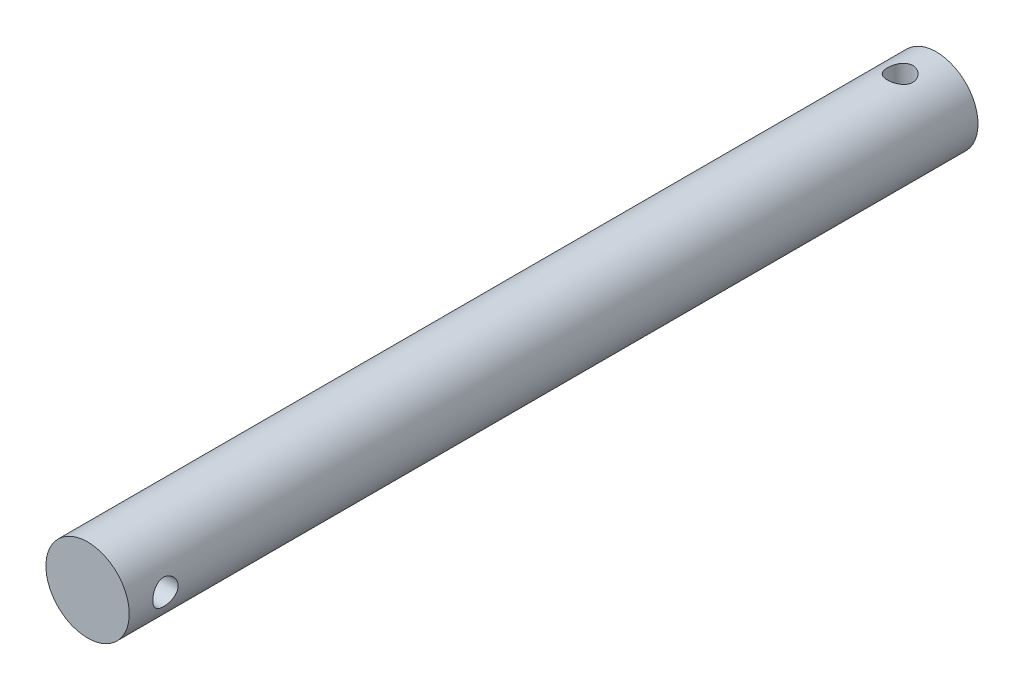
ISO-10303-21;
HEADER;
FILE_DESCRIPTION(('STEP AP214'),'2;1');
FILE_NAME('part.step','',(''),(''),'','','');
FILE_SCHEMA(('AUTOMOTIVE_DESIGN { 1 0 10303 214 1 1 1 1 }'));
ENDSEC;
DATA;
#1=APPLICATION_CONTEXT('core data for automotive mechanical design processes');
#2=APPLICATION_PROTOCOL_DEFINITION('international standard','automotive_design',2000,#1);
#3=PRODUCT_CONTEXT('',#1,'mechanical');
#4=PRODUCT('Part','Part','',(#3));
#5=PRODUCT_RELATED_PRODUCT_CATEGORY('part','',(#4));
#6=PRODUCT_DEFINITION_FORMATION('','',#4);
#7=PRODUCT_DEFINITION_CONTEXT('part definition',#1,'design');
#8=PRODUCT_DEFINITION('design','',#6,#7);
#9=PRODUCT_DEFINITION_SHAPE('','',#8);
#10=(LENGTH_UNIT() NAMED_UNIT(*) SI_UNIT(.MILLI.,.METRE.));
#11=(NAMED_UNIT(*) PLANE_ANGLE_UNIT() SI_UNIT($,.RADIAN.));
#12=(NAMED_UNIT(*) SI_UNIT($,.STERADIAN.) SOLID_ANGLE_UNIT());
#13=UNCERTAINTY_MEASURE_WITH_UNIT(LENGTH_MEASURE(1.E-05),#10,'distance_accuracy_value','');
#14=(GEOMETRIC_REPRESENTATION_CONTEXT(3) GLOBAL_UNCERTAINTY_ASSIGNED_CONTEXT((#13)) GLOBAL_UNIT_ASSIGNED_CONTEXT((#10,
#11,#12)) REPRESENTATION_CONTEXT('',''));
#15=CARTESIAN_POINT('',(0.,0.,0.));
#16=DIRECTION('',(0.,0.,1.));
#17=DIRECTION('',(1.,0.,0.));
#18=AXIS2_PLACEMENT_3D('',#15,#16,#17);
#19=CARTESIAN_POINT('',(0.,0.,117.15));
#20=DIRECTION('',(0.,0.,-1.));
#21=DIRECTION('',(-1.,0.,0.));
#22=AXIS2_PLACEMENT_3D('',#19,#20,#21);
#23=CYLINDRICAL_SURFACE('',#22,5.75);
#24=CARTESIAN_POINT('',(-5.75,0.,113.9));
#25=CARTESIAN_POINT('',(-5.74999928777835,-0.0959385713287594,113.899999015544));
#26=CARTESIAN_POINT('',(-5.74757604778291,-0.191887129062954,113.892084575488));
#27=CARTESIAN_POINT('',(-5.73814623317171,-0.380986060443953,113.860713755079));
#28=CARTESIAN_POINT('',(-5.73113840539236,-0.474135661732902,113.837253125266));
#29=CARTESIAN_POINT('',(-5.71330648621698,-0.654882106105356,113.77564875893));
#30=CARTESIAN_POINT('',(-5.70248812281643,-0.742487052017552,113.737527053072));
#31=CARTESIAN_POINT('',(-5.67815701256937,-0.910061375677811,113.647774179451));
#32=CARTESIAN_POINT('',(-5.66464388423343,-0.990029669955899,113.596141098603));
#33=CARTESIAN_POINT('',(-5.63591702088801,-1.14241673866345,113.47922889998));
#34=CARTESIAN_POINT('',(-5.62066767139372,-1.21457883766208,113.41362400026));
#35=CARTESIAN_POINT('',(-5.59039738107246,-1.3470652424525,113.27132455424));
#36=CARTESIAN_POINT('',(-5.57537648047599,-1.40738748497903,113.19462807911));
#37=CARTESIAN_POINT('',(-5.54688517999019,-1.51584662453451,113.030133541635));
#38=CARTESIAN_POINT('',(-5.53345893413336,-1.56366770328496,112.942118876368));
#39=CARTESIAN_POINT('',(-5.51021055853753,-1.64372440655954,112.758822184792));
#40=CARTESIAN_POINT('',(-5.50038753481332,-1.67596389761843,112.663541968214));
#41=CARTESIAN_POINT('',(-5.48582941838635,-1.72301200976909,112.471306009556));
#42=CARTESIAN_POINT('',(-5.48095624570664,-1.73829484939492,112.374477069449));
#43=CARTESIAN_POINT('',(-5.47643909454704,-1.75247689262192,112.179516331369));
#44=CARTESIAN_POINT('',(-5.47679380720084,-1.75138019704311,112.081384865646));
#45=CARTESIAN_POINT('',(-5.48257014127575,-1.73320623710372,111.890483676235));
#46=CARTESIAN_POINT('',(-5.48780243631886,-1.7167260602907,111.797650426375));
#47=CARTESIAN_POINT('',(-5.50243765779226,-1.66921881423739,111.616134415106));
#48=CARTESIAN_POINT('',(-5.51184100666981,-1.63819027151027,111.527452075109));
#49=CARTESIAN_POINT('',(-5.53390783991856,-1.56203354523887,111.3553078955));
#50=CARTESIAN_POINT('',(-5.54661517100887,-1.51671383693437,111.271936647735));
#51=CARTESIAN_POINT('',(-5.57383743640775,-1.41339431878934,111.11378380161));
#52=CARTESIAN_POINT('',(-5.58835281932993,-1.35539135927417,111.039004343927));
#53=CARTESIAN_POINT('',(-5.61832064885968,-1.22539861007512,110.89677497668));
#54=CARTESIAN_POINT('',(-5.63378653524159,-1.15291420100984,110.829779167661));
#55=CARTESIAN_POINT('',(-5.66335994077207,-0.997546563326113,110.708786693874));
#56=CARTESIAN_POINT('',(-5.67746736933109,-0.914662642057689,110.65479089566));
#57=CARTESIAN_POINT('',(-5.70286965528536,-0.740006340300693,110.561044550897));
#58=CARTESIAN_POINT('',(-5.7141439376432,-0.64817529977868,110.521397342513));
#59=CARTESIAN_POINT('',(-5.7324612780653,-0.458725349157116,110.458245604803));
#60=CARTESIAN_POINT('',(-5.73950555208144,-0.361108111222858,110.434736436183));
#61=CARTESIAN_POINT('',(-5.74837570451892,-0.166715146681215,110.405290141466));
#62=CARTESIAN_POINT('',(-5.75038419385996,-0.070040803003699,110.398737818359));
#63=CARTESIAN_POINT('',(-5.74949370771951,0.123033725381385,110.401663383074));
#64=CARTESIAN_POINT('',(-5.74659540842732,0.219433946031256,110.411139062127));
#65=CARTESIAN_POINT('',(-5.73633670363618,0.406884309721018,110.445355411109));
#66=CARTESIAN_POINT('',(-5.72908210804504,0.49800682478584,110.469734342159));
#67=CARTESIAN_POINT('',(-5.71095352507735,0.674846412315206,110.532627823723));
#68=CARTESIAN_POINT('',(-5.70007909823292,0.760562826945011,110.571144090647));
#69=CARTESIAN_POINT('',(-5.67551543698637,0.926402815937071,110.662236951982));
#70=CARTESIAN_POINT('',(-5.66176588879431,1.00634690585545,110.715123604028));
#71=CARTESIAN_POINT('',(-5.6330284271798,1.15643402748901,110.833080866377));
#72=CARTESIAN_POINT('',(-5.61804019507124,1.22657452438565,110.898154617639));
#73=CARTESIAN_POINT('',(-5.58781007369419,1.35778736868868,111.041530535008));
#74=CARTESIAN_POINT('',(-5.57257970682757,1.41842172800338,111.120236847127));
#75=CARTESIAN_POINT('',(-5.54418273004371,1.52565587348097,111.287038377179));
#76=CARTESIAN_POINT('',(-5.53101607277048,1.57225598171088,111.37513337959));
#77=CARTESIAN_POINT('',(-5.50838723871704,1.64978909325865,111.557962906399));
#78=CARTESIAN_POINT('',(-5.49890876907322,1.68079118431685,111.652665998298));
#79=CARTESIAN_POINT('',(-5.48479130561698,1.72630914605966,111.846292589456));
#80=CARTESIAN_POINT('',(-5.48015059135103,1.74083087782624,111.945214575311));
#81=CARTESIAN_POINT('',(-5.47640695713794,1.75256961712525,112.139911124122));
#82=CARTESIAN_POINT('',(-5.47707504747841,1.75050214376061,112.235638696941));
#83=CARTESIAN_POINT('',(-5.48332122336449,1.73083575800854,112.425313396512));
#84=CARTESIAN_POINT('',(-5.48889910143278,1.71323750191932,112.519260598326));
#85=CARTESIAN_POINT('',(-5.5041805294775,1.66347696659913,112.701500418495));
#86=CARTESIAN_POINT('',(-5.51382882124011,1.6315093919208,112.789851179647));
#87=CARTESIAN_POINT('',(-5.53615241583177,1.55406978053486,112.96000582629));
#88=CARTESIAN_POINT('',(-5.54882831079243,1.50859510171481,113.041808426924));
#89=CARTESIAN_POINT('',(-5.57636988722287,1.40344342971552,113.199851608945));
#90=CARTESIAN_POINT('',(-5.59129968881273,1.34329929003115,113.275770193865));
#91=CARTESIAN_POINT('',(-5.6213612535034,1.21135031194525,113.416669024319));
#92=CARTESIAN_POINT('',(-5.63649306859028,1.13954241675892,113.481646393311));
#93=CARTESIAN_POINT('',(-5.6658051979512,0.983676589876039,113.600789502351));
#94=CARTESIAN_POINT('',(-5.67994261557294,0.899312674628893,113.654566623443));
#95=CARTESIAN_POINT('',(-5.70515014811673,0.7223108279757,113.747100222591));
#96=CARTESIAN_POINT('',(-5.71622161936861,0.629676579305499,113.785863345656));
#97=CARTESIAN_POINT('',(-5.73314989234598,0.44827585420314,113.844019076472));
#98=CARTESIAN_POINT('',(-5.73941556358756,0.360039802026547,113.86495381595));
#99=CARTESIAN_POINT('',(-5.74784058684039,0.181205185597138,113.89294350244));
#100=CARTESIAN_POINT('',(-5.75000067264187,0.0906070464543938,113.900000929748));
#101=CARTESIAN_POINT('',(-5.75,0.,113.9));
#102=B_SPLINE_CURVE_WITH_KNOTS('',3,(#24,#25,#26,#27,#28,#29,#30,#31,#32,#33,#34,#35,#36,#37,
#38,#39,#40,#41,#42,#43,#44,#45,#46,#47,#48,#49,#50,#51,#52,#53,#54,#55,#56,#57,#58,#59,#60,#61,
#62,#63,#64,#65,#66,#67,#68,#69,#70,#71,#72,#73,#74,#75,#76,#77,#78,#79,#80,#81,#82,#83,#84,#85,
#86,#87,#88,#89,#90,#91,#92,#93,#94,#95,#96,#97,#98,#99,#100,#101),.UNSPECIFIED.,.T.,.F.,(4,2,2,
2,2,2,2,2,2,2,2,2,2,2,2,2,2,2,2,2,2,2,2,2,2,2,2,2,2,2,2,2,2,2,2,2,2,2,4),(0.,0.287482817599106,
0.575044249378853,0.862175250836252,1.14934692942179,1.44413974938822,1.73898389572087,
2.04068122222846,2.34230364475788,2.63525967032535,2.92814235194373,3.21010987256567,
3.49210595757811,3.77805449327284,4.06407412034252,4.3624063635186,4.66075848739856,
4.96121847505486,5.26159205153441,5.55090461998096,5.84017732240673,6.12269302127628,
6.40524303166018,6.69445397412987,6.98373955723926,7.28385916157827,7.58397187805472,
7.88274334860935,8.18140853062111,8.4672633499371,8.75310609020819,9.03518724951489,
9.31732362284115,9.61000113895155,9.90275548280157,10.2044074952203,10.5059258472411,
10.7774811295992,11.0489878723855),.UNSPECIFIED.);
#103=CARTESIAN_POINT('',(-5.75,0.,113.9));
#104=VERTEX_POINT('',#103);
#105=EDGE_CURVE('E35',#104,#104,#102,.T.);
#106=ORIENTED_EDGE('',*,*,#105,.T.);
#107=EDGE_LOOP('',(#106));
#108=FACE_BOUND('',#107,.T.);
#109=CARTESIAN_POINT('',(5.75,0.,110.4));
#110=CARTESIAN_POINT('',(5.74999928777835,-0.0959385713287594,110.400000984456));
#111=CARTESIAN_POINT('',(5.74757604778291,-0.191887129062953,110.407915424512));
#112=CARTESIAN_POINT('',(5.73814623317171,-0.380986060443953,110.439286244921));
#113=CARTESIAN_POINT('',(5.73113840539236,-0.474135661732902,110.462746874733));
#114=CARTESIAN_POINT('',(5.71330648621698,-0.654882106105356,110.52435124107));
#115=CARTESIAN_POINT('',(5.70248812281643,-0.742487052017552,110.562472946928));
#116=CARTESIAN_POINT('',(5.67815701256937,-0.910061375677811,110.652225820549));
#117=CARTESIAN_POINT('',(5.66464388423343,-0.990029669955899,110.703858901397));
#118=CARTESIAN_POINT('',(5.63591702088801,-1.14241673866345,110.82077110002));
#119=CARTESIAN_POINT('',(5.62066767139372,-1.21457883766208,110.88637599974));
#120=CARTESIAN_POINT('',(5.59039738107246,-1.3470652424525,111.02867544576));
#121=CARTESIAN_POINT('',(5.57537648047599,-1.40738748497903,111.10537192089));
#122=CARTESIAN_POINT('',(5.54688517999018,-1.51584662453451,111.269866458365));
#123=CARTESIAN_POINT('',(5.53345893413335,-1.56366770328498,111.357881123632));
#124=CARTESIAN_POINT('',(5.51021055853753,-1.64372440655955,111.541177815208));
#125=CARTESIAN_POINT('',(5.50038753481332,-1.67596389761843,111.636458031786));
#126=CARTESIAN_POINT('',(5.48582941838635,-1.72301200976909,111.828693990444));
#127=CARTESIAN_POINT('',(5.48095624570664,-1.73829484939492,111.925522930551));
#128=CARTESIAN_POINT('',(5.47643909454704,-1.75247689262192,112.120483668631));
#129=CARTESIAN_POINT('',(5.47679380720084,-1.75138019704311,112.218615134354));
#130=CARTESIAN_POINT('',(5.48257014127575,-1.73320623710372,112.409516323765));
#131=CARTESIAN_POINT('',(5.48780243631886,-1.7167260602907,112.502349573625));
#132=CARTESIAN_POINT('',(5.50243765779226,-1.66921881423739,112.683865584894));
#133=CARTESIAN_POINT('',(5.51184100666981,-1.63819027151027,112.772547924891));
#134=CARTESIAN_POINT('',(5.53390783991856,-1.56203354523887,112.9446921045));
#135=CARTESIAN_POINT('',(5.54661517100887,-1.51671383693437,113.028063352265));
#136=CARTESIAN_POINT('',(5.57383743640775,-1.41339431878934,113.18621619839));
#137=CARTESIAN_POINT('',(5.58835281932993,-1.35539135927416,113.260995656073));
#138=CARTESIAN_POINT('',(5.61832064885968,-1.22539861007512,113.40322502332));
#139=CARTESIAN_POINT('',(5.63378653524159,-1.15291420100984,113.470220832339));
#140=CARTESIAN_POINT('',(5.66335994077207,-0.997546563326118,113.591213306126));
#141=CARTESIAN_POINT('',(5.67746736933109,-0.914662642057691,113.64520910434));
#142=CARTESIAN_POINT('',(5.70286965528536,-0.740006340300692,113.738955449103));
#143=CARTESIAN_POINT('',(5.7141439376432,-0.64817529977868,113.778602657487));
#144=CARTESIAN_POINT('',(5.7324612780653,-0.458725349157116,113.841754395197));
#145=CARTESIAN_POINT('',(5.73950555208144,-0.361108111222859,113.865263563817));
#146=CARTESIAN_POINT('',(5.74837570451892,-0.166715146681215,113.894709858534));
#147=CARTESIAN_POINT('',(5.75038419385996,-0.070040803003699,113.901262181641));
#148=CARTESIAN_POINT('',(5.74949370771951,0.123033725381385,113.898336616926));
#149=CARTESIAN_POINT('',(5.74659540842732,0.219433946031256,113.888860937873));
#150=CARTESIAN_POINT('',(5.73633670363618,0.406884309721018,113.854644588891));
#151=CARTESIAN_POINT('',(5.72908210804504,0.49800682478584,113.830265657841));
#152=CARTESIAN_POINT('',(5.71095352507735,0.674846412315206,113.767372176277));
#153=CARTESIAN_POINT('',(5.70007909823292,0.760562826945012,113.728855909353));
#154=CARTESIAN_POINT('',(5.67551543698637,0.926402815937069,113.637763048018));
#155=CARTESIAN_POINT('',(5.66176588879431,1.00634690585545,113.584876395972));
#156=CARTESIAN_POINT('',(5.6330284271798,1.15643402748901,113.466919133623));
#157=CARTESIAN_POINT('',(5.61804019507124,1.22657452438565,113.401845382361));
#158=CARTESIAN_POINT('',(5.58781007369419,1.35778736868868,113.258469464992));
#159=CARTESIAN_POINT('',(5.57257970682757,1.41842172800338,113.179763152873));
#160=CARTESIAN_POINT('',(5.54418273004371,1.52565587348097,113.012961622821));
#161=CARTESIAN_POINT('',(5.53101607277048,1.57225598171088,112.92486662041));
#162=CARTESIAN_POINT('',(5.50838723871704,1.64978909325866,112.742037093601));
#163=CARTESIAN_POINT('',(5.49890876907322,1.68079118431685,112.647334001702));
#164=CARTESIAN_POINT('',(5.48479130561698,1.72630914605966,112.453707410544));
#165=CARTESIAN_POINT('',(5.48015059135103,1.74083087782624,112.354785424689));
#166=CARTESIAN_POINT('',(5.47640695713794,1.75256961712525,112.160088875878));
#167=CARTESIAN_POINT('',(5.47707504747841,1.75050214376061,112.064361303059));
#168=CARTESIAN_POINT('',(5.48332122336449,1.73083575800854,111.874686603488));
#169=CARTESIAN_POINT('',(5.48889910143278,1.71323750191932,111.780739401674));
#170=CARTESIAN_POINT('',(5.5041805294775,1.66347696659914,111.598499581505));
#171=CARTESIAN_POINT('',(5.51382882124011,1.63150939192081,111.510148820353));
#172=CARTESIAN_POINT('',(5.53615241583176,1.55406978053487,111.33999417371));
#173=CARTESIAN_POINT('',(5.54882831079243,1.50859510171482,111.258191573076));
#174=CARTESIAN_POINT('',(5.57636988722287,1.40344342971552,111.100148391055));
#175=CARTESIAN_POINT('',(5.59129968881272,1.34329929003115,111.024229806135));
#176=CARTESIAN_POINT('',(5.6213612535034,1.21135031194526,110.883330975681));
#177=CARTESIAN_POINT('',(5.63649306859028,1.13954241675893,110.818353606689));
#178=CARTESIAN_POINT('',(5.6658051979512,0.983676589876039,110.699210497649));
#179=CARTESIAN_POINT('',(5.67994261557294,0.899312674628893,110.645433376557));
#180=CARTESIAN_POINT('',(5.70515014811673,0.7223108279757,110.552899777409));
#181=CARTESIAN_POINT('',(5.71622161936861,0.629676579305499,110.514136654344));
#182=CARTESIAN_POINT('',(5.73314989234598,0.448275854203138,110.455980923528));
#183=CARTESIAN_POINT('',(5.73941556358756,0.360039802026543,110.43504618405));
#184=CARTESIAN_POINT('',(5.74784058684039,0.181205185597133,110.40705649756));
#185=CARTESIAN_POINT('',(5.75000067264187,0.0906070464543917,110.399999070252));
#186=CARTESIAN_POINT('',(5.75,0.,110.4));
#187=B_SPLINE_CURVE_WITH_KNOTS('',3,(#109,#110,#111,#112,#113,#114,#115,#116,#117,#118,#119,
#120,#121,#122,#123,#124,#125,#126,#127,#128,#129,#130,#131,#132,#133,#134,#135,#136,#137,#138,
#139,#140,#141,#142,#143,#144,#145,#146,#147,#148,#149,#150,#151,#152,#153,#154,#155,#156,#157,
#158,#159,#160,#161,#162,#163,#164,#165,#166,#167,#168,#169,#170,#171,#172,#173,#174,#175,#176,
#177,#178,#179,#180,#181,#182,#183,#184,#185,#186),.UNSPECIFIED.,.T.,.F.,(4,2,2,2,2,2,2,2,2,2,2,
2,2,2,2,2,2,2,2,2,2,2,2,2,2,2,2,2,2,2,2,2,2,2,2,2,2,2,4),(0.,0.287482817599106,
0.575044249378853,0.862175250836252,1.14934692942179,1.44413974938821,1.73898389572087,
2.04068122222849,2.34230364475788,2.63525967032535,2.92814235194373,3.21010987256568,
3.49210595757811,3.77805449327284,4.06407412034252,4.36240636351859,4.66075848739856,
4.96121847505486,5.26159205153441,5.55090461998096,5.84017732240673,6.12269302127628,
6.40524303166018,6.69445397412987,6.98373955723926,7.28385916157827,7.58397187805472,
7.88274334860936,8.18140853062111,8.46726334993708,8.75310609020819,9.03518724951487,
9.31732362284115,9.61000113895153,9.90275548280157,10.2044074952203,10.5059258472411,
10.7774811295993,11.0489878723855),.UNSPECIFIED.);
#188=CARTESIAN_POINT('',(5.75,0.,110.4));
#189=VERTEX_POINT('',#188);
#190=EDGE_CURVE('E87',#189,#189,#187,.T.);
#191=ORIENTED_EDGE('',*,*,#190,.T.);
#192=EDGE_LOOP('',(#191));
#193=FACE_BOUND('',#192,.T.);
#194=CARTESIAN_POINT('',(0.,0.,117.15));
#195=DIRECTION('',(0.,0.,1.));
#196=DIRECTION('',(1.,0.,0.));
#197=AXIS2_PLACEMENT_3D('',#194,#195,#196);
#198=CIRCLE('',#197,5.75);
#199=CARTESIAN_POINT('',(5.75,0.,117.15));
#200=VERTEX_POINT('',#199);
#201=EDGE_CURVE('E10',#200,#200,#198,.T.);
#202=ORIENTED_EDGE('',*,*,#201,.F.);
#203=EDGE_LOOP('',(#202));
#204=FACE_BOUND('',#203,.T.);
#205=CARTESIAN_POINT('',(0.,0.,0.));
#206=DIRECTION('',(0.,0.,1.));
#207=DIRECTION('',(1.,0.,0.));
#208=AXIS2_PLACEMENT_3D('',#205,#206,#207);
#209=CIRCLE('',#208,5.75);
#210=CARTESIAN_POINT('',(5.75,0.,0.));
#211=VERTEX_POINT('',#210);
#212=EDGE_CURVE('E43',#211,#211,#209,.T.);
#213=ORIENTED_EDGE('',*,*,#212,.T.);
#214=EDGE_LOOP('',(#213));
#215=FACE_BOUND('',#214,.T.);
#216=CARTESIAN_POINT('',(0.,-5.75,3.25));
#217=CARTESIAN_POINT('',(0.0959385713287591,-5.74999928777835,3.25000098445609));
#218=CARTESIAN_POINT('',(0.191887129062953,-5.74757604778291,3.25791542451199));
#219=CARTESIAN_POINT('',(0.380986060443951,-5.73814623317171,3.28928624492064));
#220=CARTESIAN_POINT('',(0.4741356617329,-5.73113840539236,3.3127468747335));
#221=CARTESIAN_POINT('',(0.654882106105352,-5.71330648621698,3.37435124106983));
#222=CARTESIAN_POINT('',(0.742487052017546,-5.70248812281644,3.41247294692825));
#223=CARTESIAN_POINT('',(0.910061375677803,-5.67815701256937,3.50222582054881));
#224=CARTESIAN_POINT('',(0.99002966995589,-5.66464388423343,3.55385890139742));
#225=CARTESIAN_POINT('',(1.14241673866344,-5.63591702088801,3.67077110002036));
#226=CARTESIAN_POINT('',(1.21457883766207,-5.62066767139372,3.7363759997399));
#227=CARTESIAN_POINT('',(1.34706524245249,-5.59039738107246,3.8786754457603));
#228=CARTESIAN_POINT('',(1.40738748497902,-5.57537648047599,3.95537192089033));
#229=CARTESIAN_POINT('',(1.5158466245345,-5.54688517999019,4.11986645836505));
#230=CARTESIAN_POINT('',(1.56366770328496,-5.53345893413336,4.20788112363194));
#231=CARTESIAN_POINT('',(1.64372440655953,-5.51021055853754,4.39117781520815));
#232=CARTESIAN_POINT('',(1.67596389761842,-5.50038753481332,4.48645803178633));
#233=CARTESIAN_POINT('',(1.72301200976908,-5.48582941838635,4.67869399044358));
#234=CARTESIAN_POINT('',(1.73829484939491,-5.48095624570665,4.77552293055072));
#235=CARTESIAN_POINT('',(1.75247689262191,-5.47643909454705,4.97048366863124));
#236=CARTESIAN_POINT('',(1.7513801970431,-5.47679380720085,5.06861513435426));
#237=CARTESIAN_POINT('',(1.73320623710371,-5.48257014127575,5.25951632376466));
#238=CARTESIAN_POINT('',(1.71672606029069,-5.48780243631886,5.35234957362478));
#239=CARTESIAN_POINT('',(1.66921881423738,-5.50243765779226,5.53386558489435));
#240=CARTESIAN_POINT('',(1.63819027151026,-5.51184100666981,5.62254792489071));
#241=CARTESIAN_POINT('',(1.56203354523885,-5.53390783991856,5.79469210450024));
#242=CARTESIAN_POINT('',(1.51671383693436,-5.54661517100887,5.87806335226514));
#243=CARTESIAN_POINT('',(1.41339431878933,-5.57383743640775,6.0362161983899));
#244=CARTESIAN_POINT('',(1.35539135927416,-5.58835281932994,6.1109956560725));
#245=CARTESIAN_POINT('',(1.22539861007511,-5.61832064885968,6.25322502332016));
#246=CARTESIAN_POINT('',(1.15291420100984,-5.63378653524159,6.32022083233922));
#247=CARTESIAN_POINT('',(0.997546563326113,-5.66335994077207,6.4412133061259));
#248=CARTESIAN_POINT('',(0.914662642057686,-5.67746736933109,6.49520910433986));
#249=CARTESIAN_POINT('',(0.740006340300687,-5.70286965528536,6.58895544910279));
#250=CARTESIAN_POINT('',(0.648175299778673,-5.7141439376432,6.62860265748745));
#251=CARTESIAN_POINT('',(0.458725349157109,-5.7324612780653,6.69175439519696));
#252=CARTESIAN_POINT('',(0.361108111222851,-5.73950555208144,6.71526356381708));
#253=CARTESIAN_POINT('',(0.166715146681207,-5.74837570451892,6.74470985853363));
#254=CARTESIAN_POINT('',(0.070040803003693,-5.75038419385996,6.75126218164074));
#255=CARTESIAN_POINT('',(-0.12303372538139,-5.74949370771951,6.74833661692566));
#256=CARTESIAN_POINT('',(-0.21943394603126,-5.74659540842732,6.73886093787281));
#257=CARTESIAN_POINT('',(-0.406884309721018,-5.73633670363618,6.70464458889131));
#258=CARTESIAN_POINT('',(-0.498006824785836,-5.72908210804503,6.68026565784105));
#259=CARTESIAN_POINT('',(-0.6748464123152,-5.71095352507735,6.61737217627732));
#260=CARTESIAN_POINT('',(-0.760562826945007,-5.70007909823292,6.57885590935332));
#261=CARTESIAN_POINT('',(-0.926402815937066,-5.67551543698637,6.48776304801783));
#262=CARTESIAN_POINT('',(-1.00634690585544,-5.66176588879431,6.43487639597208));
#263=CARTESIAN_POINT('',(-1.156434027489,-5.6330284271798,6.31691913362321));
#264=CARTESIAN_POINT('',(-1.22657452438564,-5.61804019507124,6.25184538236129));
#265=CARTESIAN_POINT('',(-1.35778736868868,-5.58781007369419,6.10846946499204));
#266=CARTESIAN_POINT('',(-1.41842172800337,-5.57257970682757,6.02976315287282));
#267=CARTESIAN_POINT('',(-1.52565587348096,-5.54418273004371,5.86296162282136));
#268=CARTESIAN_POINT('',(-1.57225598171087,-5.53101607277048,5.77486662040964));
#269=CARTESIAN_POINT('',(-1.64978909325864,-5.50838723871704,5.59203709360121));
#270=CARTESIAN_POINT('',(-1.68079118431684,-5.49890876907322,5.49733400170234));
#271=CARTESIAN_POINT('',(-1.72630914605965,-5.48479130561698,5.30370741054431));
#272=CARTESIAN_POINT('',(-1.74083087782623,-5.48015059135103,5.20478542468901));
#273=CARTESIAN_POINT('',(-1.75256961712523,-5.47640695713795,5.0100888758783));
#274=CARTESIAN_POINT('',(-1.7505021437606,-5.47707504747841,4.91436130305891));
#275=CARTESIAN_POINT('',(-1.73083575800853,-5.4833212233645,4.72468660348847));
#276=CARTESIAN_POINT('',(-1.71323750191931,-5.48889910143278,4.63073940167405));
#277=CARTESIAN_POINT('',(-1.66347696659913,-5.5041805294775,4.44849958150498));
#278=CARTESIAN_POINT('',(-1.6315093919208,-5.51382882124011,4.36014882035343));
#279=CARTESIAN_POINT('',(-1.55406978053486,-5.53615241583177,4.18999417370982));
#280=CARTESIAN_POINT('',(-1.5085951017148,-5.54882831079243,4.10819157307554));
#281=CARTESIAN_POINT('',(-1.40344342971551,-5.57636988722287,3.95014839105541));
#282=CARTESIAN_POINT('',(-1.34329929003114,-5.59129968881273,3.87422980613475));
#283=CARTESIAN_POINT('',(-1.21135031194524,-5.6213612535034,3.73333097568074));
#284=CARTESIAN_POINT('',(-1.13954241675891,-5.63649306859029,3.66835360668869));
#285=CARTESIAN_POINT('',(-0.983676589876031,-5.6658051979512,3.54921049764876));
#286=CARTESIAN_POINT('',(-0.899312674628887,-5.67994261557294,3.49543337655733));
#287=CARTESIAN_POINT('',(-0.722310827975696,-5.70515014811673,3.40289977740904));
#288=CARTESIAN_POINT('',(-0.629676579305494,-5.71622161936861,3.36413665434357));
#289=CARTESIAN_POINT('',(-0.448275854203135,-5.73314989234598,3.30598092352814));
#290=CARTESIAN_POINT('',(-0.360039802026543,-5.73941556358756,3.28504618404956));
#291=CARTESIAN_POINT('',(-0.181205185597135,-5.74784058684039,3.2570564975598));
#292=CARTESIAN_POINT('',(-0.0906070464543924,-5.75000067264187,3.24999907025237));
#293=CARTESIAN_POINT('',(0.,-5.75,3.25));
#294=B_SPLINE_CURVE_WITH_KNOTS('',3,(#216,#217,#218,#219,#220,#221,#222,#223,#224,#225,#226,
#227,#228,#229,#230,#231,#232,#233,#234,#235,#236,#237,#238,#239,#240,#241,#242,#243,#244,#245,
#246,#247,#248,#249,#250,#251,#252,#253,#254,#255,#256,#257,#258,#259,#260,#261,#262,#263,#264,
#265,#266,#267,#268,#269,#270,#271,#272,#273,#274,#275,#276,#277,#278,#279,#280,#281,#282,#283,
#284,#285,#286,#287,#288,#289,#290,#291,#292,#293),.UNSPECIFIED.,.T.,.F.,(4,2,2,2,2,2,2,2,2,2,2,
2,2,2,2,2,2,2,2,2,2,2,2,2,2,2,2,2,2,2,2,2,2,2,2,2,2,2,4),(0.,0.287482817599105,0.57504424937885,
0.862175250836247,1.14934692942177,1.4441397493882,1.73898389572086,2.04068122222845,
2.34230364475786,2.63525967032531,2.92814235194371,3.21010987256565,3.49210595757809,
3.77805449327281,4.06407412034249,4.36240636351856,4.66075848739852,4.96121847505483,
5.26159205153438,5.55090461998093,5.8401773224067,6.12269302127624,6.40524303166014,
6.69445397412982,6.98373955723922,7.28385916157821,7.58397187805467,7.8827433486093,
8.18140853062105,8.46726334993702,8.75310609020813,9.03518724951482,9.31732362284109,
9.61000113895148,9.9027554828015,10.2044074952202,10.505925847241,10.7774811295992,
11.0489878723855),.UNSPECIFIED.);
#295=CARTESIAN_POINT('',(0.,-5.75,3.25));
#296=VERTEX_POINT('',#295);
#297=EDGE_CURVE('E51',#296,#296,#294,.T.);
#298=ORIENTED_EDGE('',*,*,#297,.F.);
#299=EDGE_LOOP('',(#298));
#300=FACE_BOUND('',#299,.T.);
#301=CARTESIAN_POINT('',(0.,5.75,3.25));
#302=CARTESIAN_POINT('',(-0.0959385713287591,5.74999928777835,3.25000098445609));
#303=CARTESIAN_POINT('',(-0.191887129062953,5.74757604778291,3.25791542451199));
#304=CARTESIAN_POINT('',(-0.380986060443951,5.73814623317171,3.28928624492064));
#305=CARTESIAN_POINT('',(-0.4741356617329,5.73113840539236,3.3127468747335));
#306=CARTESIAN_POINT('',(-0.654882106105352,5.71330648621698,3.37435124106983));
#307=CARTESIAN_POINT('',(-0.742487052017546,5.70248812281644,3.41247294692825));
#308=CARTESIAN_POINT('',(-0.910061375677803,5.67815701256937,3.50222582054881));
#309=CARTESIAN_POINT('',(-0.99002966995589,5.66464388423343,3.55385890139742));
#310=CARTESIAN_POINT('',(-1.14241673866344,5.63591702088801,3.67077110002036));
#311=CARTESIAN_POINT('',(-1.21457883766207,5.62066767139372,3.7363759997399));
#312=CARTESIAN_POINT('',(-1.34706524245249,5.59039738107246,3.8786754457603));
#313=CARTESIAN_POINT('',(-1.40738748497902,5.57537648047599,3.95537192089033));
#314=CARTESIAN_POINT('',(-1.5158466245345,5.54688517999019,4.11986645836505));
#315=CARTESIAN_POINT('',(-1.56366770328496,5.53345893413336,4.20788112363194));
#316=CARTESIAN_POINT('',(-1.64372440655953,5.51021055853754,4.39117781520815));
#317=CARTESIAN_POINT('',(-1.67596389761842,5.50038753481332,4.48645803178633));
#318=CARTESIAN_POINT('',(-1.72301200976908,5.48582941838635,4.67869399044358));
#319=CARTESIAN_POINT('',(-1.73829484939491,5.48095624570665,4.77552293055072));
#320=CARTESIAN_POINT('',(-1.75247689262191,5.47643909454705,4.97048366863124));
#321=CARTESIAN_POINT('',(-1.7513801970431,5.47679380720085,5.06861513435426));
#322=CARTESIAN_POINT('',(-1.73320623710371,5.48257014127575,5.25951632376466));
#323=CARTESIAN_POINT('',(-1.71672606029069,5.48780243631886,5.35234957362478));
#324=CARTESIAN_POINT('',(-1.66921881423738,5.50243765779226,5.53386558489435));
#325=CARTESIAN_POINT('',(-1.63819027151026,5.51184100666981,5.62254792489071));
#326=CARTESIAN_POINT('',(-1.56203354523885,5.53390783991856,5.79469210450024));
#327=CARTESIAN_POINT('',(-1.51671383693436,5.54661517100887,5.87806335226514));
#328=CARTESIAN_POINT('',(-1.41339431878933,5.57383743640775,6.0362161983899));
#329=CARTESIAN_POINT('',(-1.35539135927416,5.58835281932994,6.1109956560725));
#330=CARTESIAN_POINT('',(-1.22539861007511,5.61832064885968,6.25322502332016));
#331=CARTESIAN_POINT('',(-1.15291420100984,5.63378653524159,6.32022083233922));
#332=CARTESIAN_POINT('',(-0.997546563326113,5.66335994077207,6.4412133061259));
#333=CARTESIAN_POINT('',(-0.914662642057686,5.67746736933109,6.49520910433986));
#334=CARTESIAN_POINT('',(-0.740006340300687,5.70286965528536,6.58895544910279));
#335=CARTESIAN_POINT('',(-0.648175299778673,5.7141439376432,6.62860265748745));
#336=CARTESIAN_POINT('',(-0.458725349157109,5.7324612780653,6.69175439519696));
#337=CARTESIAN_POINT('',(-0.361108111222851,5.73950555208144,6.71526356381708));
#338=CARTESIAN_POINT('',(-0.166715146681207,5.74837570451892,6.74470985853363));
#339=CARTESIAN_POINT('',(-0.070040803003693,5.75038419385996,6.75126218164074));
#340=CARTESIAN_POINT('',(0.12303372538139,5.74949370771951,6.74833661692566));
#341=CARTESIAN_POINT('',(0.21943394603126,5.74659540842732,6.73886093787281));
#342=CARTESIAN_POINT('',(0.406884309721018,5.73633670363618,6.70464458889131));
#343=CARTESIAN_POINT('',(0.498006824785836,5.72908210804503,6.68026565784105));
#344=CARTESIAN_POINT('',(0.6748464123152,5.71095352507735,6.61737217627732));
#345=CARTESIAN_POINT('',(0.760562826945007,5.70007909823292,6.57885590935332));
#346=CARTESIAN_POINT('',(0.926402815937066,5.67551543698637,6.48776304801783));
#347=CARTESIAN_POINT('',(1.00634690585544,5.66176588879431,6.43487639597208));
#348=CARTESIAN_POINT('',(1.156434027489,5.6330284271798,6.31691913362321));
#349=CARTESIAN_POINT('',(1.22657452438564,5.61804019507124,6.25184538236129));
#350=CARTESIAN_POINT('',(1.35778736868868,5.58781007369419,6.10846946499204));
#351=CARTESIAN_POINT('',(1.41842172800337,5.57257970682757,6.02976315287282));
#352=CARTESIAN_POINT('',(1.52565587348096,5.54418273004371,5.86296162282136));
#353=CARTESIAN_POINT('',(1.57225598171087,5.53101607277048,5.77486662040964));
#354=CARTESIAN_POINT('',(1.64978909325864,5.50838723871704,5.59203709360121));
#355=CARTESIAN_POINT('',(1.68079118431684,5.49890876907322,5.49733400170234));
#356=CARTESIAN_POINT('',(1.72630914605965,5.48479130561698,5.30370741054431));
#357=CARTESIAN_POINT('',(1.74083087782623,5.48015059135103,5.20478542468901));
#358=CARTESIAN_POINT('',(1.75256961712523,5.47640695713795,5.0100888758783));
#359=CARTESIAN_POINT('',(1.7505021437606,5.47707504747841,4.91436130305891));
#360=CARTESIAN_POINT('',(1.73083575800853,5.4833212233645,4.72468660348847));
#361=CARTESIAN_POINT('',(1.71323750191931,5.48889910143278,4.63073940167405));
#362=CARTESIAN_POINT('',(1.66347696659913,5.5041805294775,4.44849958150498));
#363=CARTESIAN_POINT('',(1.6315093919208,5.51382882124011,4.36014882035343));
#364=CARTESIAN_POINT('',(1.55406978053486,5.53615241583177,4.18999417370982));
#365=CARTESIAN_POINT('',(1.5085951017148,5.54882831079243,4.10819157307554));
#366=CARTESIAN_POINT('',(1.40344342971551,5.57636988722287,3.95014839105541));
#367=CARTESIAN_POINT('',(1.34329929003114,5.59129968881273,3.87422980613475));
#368=CARTESIAN_POINT('',(1.21135031194524,5.6213612535034,3.73333097568074));
#369=CARTESIAN_POINT('',(1.13954241675891,5.63649306859029,3.66835360668869));
#370=CARTESIAN_POINT('',(0.983676589876031,5.6658051979512,3.54921049764876));
#371=CARTESIAN_POINT('',(0.899312674628887,5.67994261557294,3.49543337655733));
#372=CARTESIAN_POINT('',(0.722310827975696,5.70515014811673,3.40289977740904));
#373=CARTESIAN_POINT('',(0.629676579305494,5.71622161936861,3.36413665434357));
#374=CARTESIAN_POINT('',(0.448275854203135,5.73314989234598,3.30598092352814));
#375=CARTESIAN_POINT('',(0.360039802026543,5.73941556358756,3.28504618404956));
#376=CARTESIAN_POINT('',(0.181205185597135,5.74784058684039,3.2570564975598));
#377=CARTESIAN_POINT('',(0.0906070464543924,5.75000067264187,3.24999907025237));
#378=CARTESIAN_POINT('',(0.,5.75,3.25));
#379=B_SPLINE_CURVE_WITH_KNOTS('',3,(#301,#302,#303,#304,#305,#306,#307,#308,#309,#310,#311,
#312,#313,#314,#315,#316,#317,#318,#319,#320,#321,#322,#323,#324,#325,#326,#327,#328,#329,#330,
#331,#332,#333,#334,#335,#336,#337,#338,#339,#340,#341,#342,#343,#344,#345,#346,#347,#348,#349,
#350,#351,#352,#353,#354,#355,#356,#357,#358,#359,#360,#361,#362,#363,#364,#365,#366,#367,#368,
#369,#370,#371,#372,#373,#374,#375,#376,#377,#378),.UNSPECIFIED.,.T.,.F.,(4,2,2,2,2,2,2,2,2,2,2,
2,2,2,2,2,2,2,2,2,2,2,2,2,2,2,2,2,2,2,2,2,2,2,2,2,2,2,4),(0.,0.287482817599105,0.57504424937885,
0.862175250836247,1.14934692942177,1.4441397493882,1.73898389572086,2.04068122222845,
2.34230364475786,2.63525967032531,2.92814235194371,3.21010987256565,3.49210595757809,
3.77805449327281,4.06407412034249,4.36240636351856,4.66075848739852,4.96121847505483,
5.26159205153438,5.55090461998093,5.8401773224067,6.12269302127624,6.40524303166014,
6.69445397412982,6.98373955723922,7.28385916157821,7.58397187805467,7.8827433486093,
8.18140853062105,8.46726334993702,8.75310609020813,9.03518724951482,9.31732362284109,
9.61000113895148,9.9027554828015,10.2044074952202,10.505925847241,10.7774811295992,
11.0489878723855),.UNSPECIFIED.);
#380=CARTESIAN_POINT('',(0.,5.75,3.25));
#381=VERTEX_POINT('',#380);
#382=EDGE_CURVE('E48',#381,#381,#379,.T.);
#383=ORIENTED_EDGE('',*,*,#382,.F.);
#384=EDGE_LOOP('',(#383));
#385=FACE_BOUND('',#384,.T.);
#386=ADVANCED_FACE('F31',(#108,#193,#204,#215,#300,#385),#23,.T.);
#387=CARTESIAN_POINT('',(0.,0.,117.15));
#388=DIRECTION('',(0.,0.,1.));
#389=DIRECTION('',(1.,0.,0.));
#390=AXIS2_PLACEMENT_3D('',#387,#388,#389);
#391=PLANE('',#390);
#392=ORIENTED_EDGE('',*,*,#201,.T.);
#393=EDGE_LOOP('',(#392));
#394=FACE_BOUND('',#393,.T.);
#395=ADVANCED_FACE('F69',(#394),#391,.T.);
#396=CARTESIAN_POINT('',(0.,0.,0.));
#397=DIRECTION('',(0.,0.,1.));
#398=DIRECTION('',(1.,0.,0.));
#399=AXIS2_PLACEMENT_3D('',#396,#397,#398);
#400=PLANE('',#399);
#401=ORIENTED_EDGE('',*,*,#212,.F.);
#402=EDGE_LOOP('',(#401));
#403=FACE_BOUND('',#402,.T.);
#404=ADVANCED_FACE('F66',(#403),#400,.F.);
#405=CARTESIAN_POINT('',(0.,15.,5.));
#406=DIRECTION('',(0.,-1.,0.));
#407=DIRECTION('',(0.,0.,-1.));
#408=AXIS2_PLACEMENT_3D('',#405,#406,#407);
#409=CYLINDRICAL_SURFACE('',#408,1.75);
#410=ORIENTED_EDGE('',*,*,#297,.T.);
#411=EDGE_LOOP('',(#410));
#412=FACE_BOUND('',#411,.T.);
#413=ORIENTED_EDGE('',*,*,#382,.T.);
#414=EDGE_LOOP('',(#413));
#415=FACE_BOUND('',#414,.T.);
#416=ADVANCED_FACE('F61',(#412,#415),#409,.F.);
#417=CARTESIAN_POINT('',(-15.,0.,112.15));
#418=DIRECTION('',(1.,0.,0.));
#419=DIRECTION('',(0.,0.,-1.));
#420=AXIS2_PLACEMENT_3D('',#417,#418,#419);
#421=CYLINDRICAL_SURFACE('',#420,1.75000000000001);
#422=ORIENTED_EDGE('',*,*,#190,.F.);
#423=EDGE_LOOP('',(#422));
#424=FACE_BOUND('',#423,.T.);
#425=ORIENTED_EDGE('',*,*,#105,.F.);
#426=EDGE_LOOP('',(#425));
#427=FACE_BOUND('',#426,.T.);
#428=ADVANCED_FACE('F65',(#424,#427),#421,.F.);
#429=CLOSED_SHELL('',(#386,#395,#404,#416,#428));
#430=MANIFOLD_SOLID_BREP('B2',#429);
#431=ADVANCED_BREP_SHAPE_REPRESENTATION('',(#18,#430),#14);
#432=SHAPE_DEFINITION_REPRESENTATION(#9,#431);
ENDSEC;
END-ISO-10303-21;
